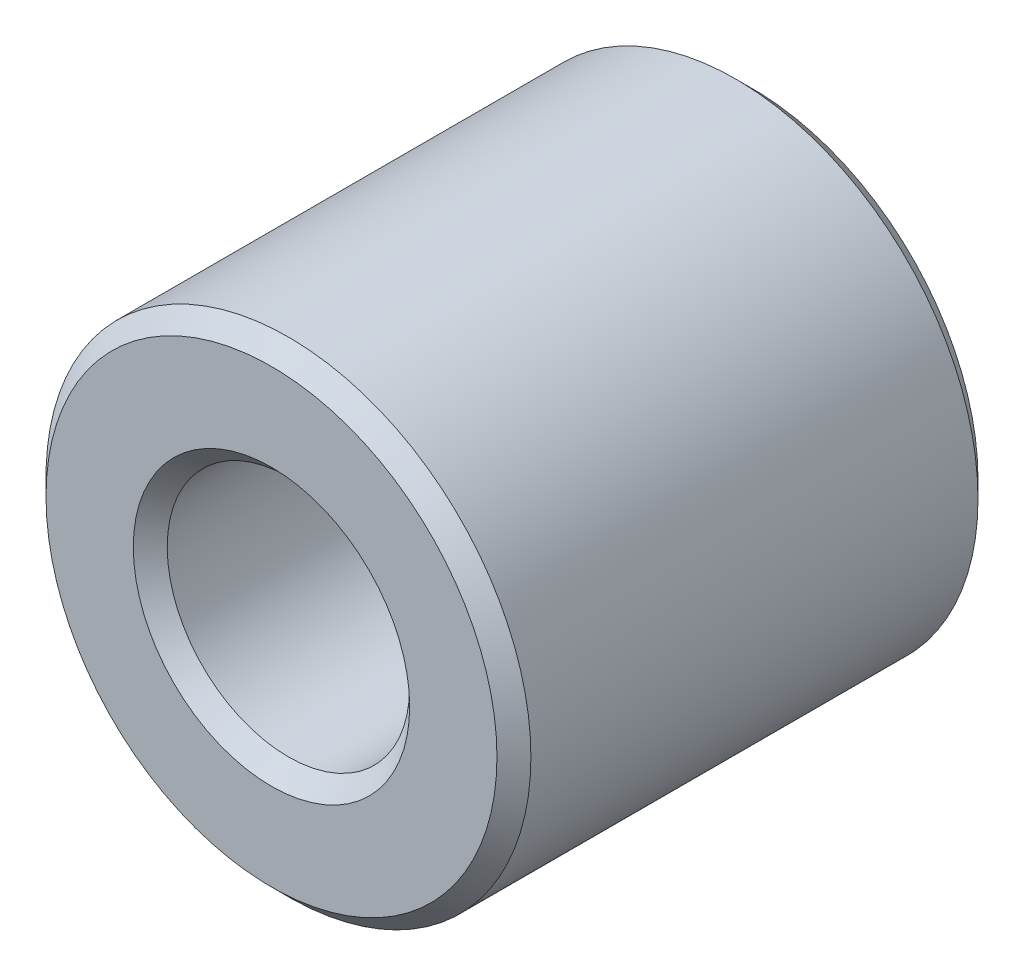
ISO-10303-21;
HEADER;
FILE_DESCRIPTION(('STEP AP214'),'2;1');
FILE_NAME('part.step','',(''),(''),'','','');
FILE_SCHEMA(('AUTOMOTIVE_DESIGN { 1 0 10303 214 1 1 1 1 }'));
ENDSEC;
DATA;
#1=APPLICATION_CONTEXT('core data for automotive mechanical design processes');
#2=APPLICATION_PROTOCOL_DEFINITION('international standard','automotive_design',2000,#1);
#3=PRODUCT_CONTEXT('',#1,'mechanical');
#4=PRODUCT('Part','Part','',(#3));
#5=PRODUCT_RELATED_PRODUCT_CATEGORY('part','',(#4));
#6=PRODUCT_DEFINITION_FORMATION('','',#4);
#7=PRODUCT_DEFINITION_CONTEXT('part definition',#1,'design');
#8=PRODUCT_DEFINITION('design','',#6,#7);
#9=PRODUCT_DEFINITION_SHAPE('','',#8);
#10=(LENGTH_UNIT() NAMED_UNIT(*) SI_UNIT(.MILLI.,.METRE.));
#11=(NAMED_UNIT(*) PLANE_ANGLE_UNIT() SI_UNIT($,.RADIAN.));
#12=(NAMED_UNIT(*) SI_UNIT($,.STERADIAN.) SOLID_ANGLE_UNIT());
#13=UNCERTAINTY_MEASURE_WITH_UNIT(LENGTH_MEASURE(1.E-05),#10,'distance_accuracy_value','');
#14=(GEOMETRIC_REPRESENTATION_CONTEXT(3) GLOBAL_UNCERTAINTY_ASSIGNED_CONTEXT((#13)) GLOBAL_UNIT_ASSIGNED_CONTEXT((#10,
#11,#12)) REPRESENTATION_CONTEXT('',''));
#15=CARTESIAN_POINT('',(0.,0.,0.));
#16=DIRECTION('',(0.,0.,1.));
#17=DIRECTION('',(1.,0.,0.));
#18=AXIS2_PLACEMENT_3D('',#15,#16,#17);
#19=CARTESIAN_POINT('',(0.,0.,-3.175));
#20=DIRECTION('',(0.,0.,1.));
#21=DIRECTION('',(1.,0.,0.));
#22=AXIS2_PLACEMENT_3D('',#19,#20,#21);
#23=CYLINDRICAL_SURFACE('',#22,3.2004);
#24=CARTESIAN_POINT('',(0.,0.,-2.950972));
#25=DIRECTION('',(0.,0.,1.));
#26=DIRECTION('',(1.,0.,0.));
#27=AXIS2_PLACEMENT_3D('',#24,#25,#26);
#28=CIRCLE('',#27,3.2004);
#29=CARTESIAN_POINT('',(3.2004,0.,-2.950972));
#30=VERTEX_POINT('',#29);
#31=EDGE_CURVE('E78',#30,#30,#28,.T.);
#32=ORIENTED_EDGE('',*,*,#31,.T.);
#33=EDGE_LOOP('',(#32));
#34=FACE_BOUND('',#33,.T.);
#35=CARTESIAN_POINT('',(0.,0.,2.950972));
#36=DIRECTION('',(0.,0.,1.));
#37=DIRECTION('',(1.,0.,0.));
#38=AXIS2_PLACEMENT_3D('',#35,#36,#37);
#39=CIRCLE('',#38,3.2004);
#40=CARTESIAN_POINT('',(3.2004,0.,2.950972));
#41=VERTEX_POINT('',#40);
#42=EDGE_CURVE('E82',#41,#41,#39,.F.);
#43=ORIENTED_EDGE('',*,*,#42,.T.);
#44=EDGE_LOOP('',(#43));
#45=FACE_BOUND('',#44,.T.);
#46=ADVANCED_FACE('F43',(#34,#45),#23,.T.);
#47=CARTESIAN_POINT('',(0.,0.,-3.175));
#48=DIRECTION('',(0.,0.,1.));
#49=DIRECTION('',(1.,0.,0.));
#50=AXIS2_PLACEMENT_3D('',#47,#48,#49);
#51=PLANE('',#50);
#52=CARTESIAN_POINT('',(0.,0.,-3.175));
#53=DIRECTION('',(0.,0.,1.));
#54=DIRECTION('',(1.,0.,0.));
#55=AXIS2_PLACEMENT_3D('',#52,#53,#54);
#56=CIRCLE('',#55,2.976372);
#57=CARTESIAN_POINT('',(2.976372,0.,-3.175));
#58=VERTEX_POINT('',#57);
#59=EDGE_CURVE('E70',#58,#58,#56,.F.);
#60=ORIENTED_EDGE('',*,*,#59,.T.);
#61=EDGE_LOOP('',(#60));
#62=FACE_BOUND('',#61,.T.);
#63=CARTESIAN_POINT('',(0.,0.,-3.175));
#64=DIRECTION('',(0.,0.,1.));
#65=DIRECTION('',(1.,0.,0.));
#66=AXIS2_PLACEMENT_3D('',#63,#64,#65);
#67=CIRCLE('',#66,1.824228);
#68=CARTESIAN_POINT('',(-1.824228,0.,-3.175));
#69=VERTEX_POINT('',#68);
#70=EDGE_CURVE('E74',#69,#69,#67,.T.);
#71=ORIENTED_EDGE('',*,*,#70,.T.);
#72=EDGE_LOOP('',(#71));
#73=FACE_BOUND('',#72,.T.);
#74=ADVANCED_FACE('F98',(#62,#73),#51,.F.);
#75=CARTESIAN_POINT('',(0.,0.,-3.175));
#76=DIRECTION('',(0.,0.,1.));
#77=DIRECTION('',(1.,0.,0.));
#78=AXIS2_PLACEMENT_3D('',#75,#76,#77);
#79=CYLINDRICAL_SURFACE('',#78,1.6002);
#80=CARTESIAN_POINT('',(0.,0.,-2.950972));
#81=DIRECTION('',(0.,0.,1.));
#82=DIRECTION('',(1.,0.,0.));
#83=AXIS2_PLACEMENT_3D('',#80,#81,#82);
#84=CIRCLE('',#83,1.6002);
#85=CARTESIAN_POINT('',(-1.6002,0.,-2.950972));
#86=VERTEX_POINT('',#85);
#87=EDGE_CURVE('E58',#86,#86,#84,.F.);
#88=ORIENTED_EDGE('',*,*,#87,.T.);
#89=EDGE_LOOP('',(#88));
#90=FACE_BOUND('',#89,.T.);
#91=CARTESIAN_POINT('',(0.,0.,2.950972));
#92=DIRECTION('',(0.,0.,1.));
#93=DIRECTION('',(1.,0.,0.));
#94=AXIS2_PLACEMENT_3D('',#91,#92,#93);
#95=CIRCLE('',#94,1.6002);
#96=CARTESIAN_POINT('',(1.6002,0.,2.950972));
#97=VERTEX_POINT('',#96);
#98=EDGE_CURVE('E64',#97,#97,#95,.T.);
#99=ORIENTED_EDGE('',*,*,#98,.T.);
#100=EDGE_LOOP('',(#99));
#101=FACE_BOUND('',#100,.T.);
#102=ADVANCED_FACE('F104',(#90,#101),#79,.F.);
#103=CARTESIAN_POINT('',(0.,0.,3.175));
#104=DIRECTION('',(0.,0.,1.));
#105=DIRECTION('',(1.,0.,0.));
#106=AXIS2_PLACEMENT_3D('',#103,#104,#105);
#107=PLANE('',#106);
#108=CARTESIAN_POINT('',(0.,0.,3.175));
#109=DIRECTION('',(0.,0.,1.));
#110=DIRECTION('',(1.,0.,0.));
#111=AXIS2_PLACEMENT_3D('',#108,#109,#110);
#112=CIRCLE('',#111,1.824228);
#113=CARTESIAN_POINT('',(1.824228,0.,3.175));
#114=VERTEX_POINT('',#113);
#115=EDGE_CURVE('E10',#114,#114,#112,.F.);
#116=ORIENTED_EDGE('',*,*,#115,.T.);
#117=EDGE_LOOP('',(#116));
#118=FACE_BOUND('',#117,.T.);
#119=CARTESIAN_POINT('',(0.,0.,3.175));
#120=DIRECTION('',(0.,0.,1.));
#121=DIRECTION('',(1.,0.,0.));
#122=AXIS2_PLACEMENT_3D('',#119,#120,#121);
#123=CIRCLE('',#122,2.976372);
#124=CARTESIAN_POINT('',(2.976372,0.,3.175));
#125=VERTEX_POINT('',#124);
#126=EDGE_CURVE('E52',#125,#125,#123,.T.);
#127=ORIENTED_EDGE('',*,*,#126,.T.);
#128=EDGE_LOOP('',(#127));
#129=FACE_BOUND('',#128,.T.);
#130=ADVANCED_FACE('F116',(#118,#129),#107,.T.);
#131=CARTESIAN_POINT('',(0.,0.,-2.950972));
#132=DIRECTION('',(0.,0.,1.));
#133=DIRECTION('',(1.,0.,0.));
#134=AXIS2_PLACEMENT_3D('',#131,#132,#133);
#135=CONICAL_SURFACE('',#134,3.2004,0.785398163397449);
#136=ORIENTED_EDGE('',*,*,#59,.F.);
#137=EDGE_LOOP('',(#136));
#138=FACE_BOUND('',#137,.T.);
#139=ORIENTED_EDGE('',*,*,#31,.F.);
#140=EDGE_LOOP('',(#139));
#141=FACE_BOUND('',#140,.T.);
#142=ADVANCED_FACE('F110',(#138,#141),#135,.T.);
#143=CARTESIAN_POINT('',(0.,0.,-3.175));
#144=DIRECTION('',(0.,0.,-1.));
#145=DIRECTION('',(-1.,0.,0.));
#146=AXIS2_PLACEMENT_3D('',#143,#144,#145);
#147=CONICAL_SURFACE('',#146,1.824228,0.785398163397447);
#148=CARTESIAN_POINT('',(-1.6002,0.,-2.950972));
#149=CARTESIAN_POINT('',(-1.602533625,0.,-2.953305625));
#150=CARTESIAN_POINT('',(-1.60486725,0.,-2.95563925));
#151=CARTESIAN_POINT('',(-1.6095345,0.,-2.9603065));
#152=CARTESIAN_POINT('',(-1.611868125,0.,-2.962640125));
#153=CARTESIAN_POINT('',(-1.616535375,0.,-2.967307375));
#154=CARTESIAN_POINT('',(-1.618869,0.,-2.969641));
#155=CARTESIAN_POINT('',(-1.62353625,0.,-2.97430825));
#156=CARTESIAN_POINT('',(-1.625869875,0.,-2.976641875));
#157=CARTESIAN_POINT('',(-1.630537125,0.,-2.981309125));
#158=CARTESIAN_POINT('',(-1.63287075,0.,-2.98364275));
#159=CARTESIAN_POINT('',(-1.637538,0.,-2.98831));
#160=CARTESIAN_POINT('',(-1.639871625,0.,-2.990643625));
#161=CARTESIAN_POINT('',(-1.644538875,0.,-2.995310875));
#162=CARTESIAN_POINT('',(-1.6468725,0.,-2.9976445));
#163=CARTESIAN_POINT('',(-1.65153975,0.,-3.00231175));
#164=CARTESIAN_POINT('',(-1.653873375,0.,-3.004645375));
#165=CARTESIAN_POINT('',(-1.658540625,0.,-3.009312625));
#166=CARTESIAN_POINT('',(-1.66087425,0.,-3.01164625));
#167=CARTESIAN_POINT('',(-1.6655415,0.,-3.0163135));
#168=CARTESIAN_POINT('',(-1.667875125,0.,-3.018647125));
#169=CARTESIAN_POINT('',(-1.672542375,0.,-3.023314375));
#170=CARTESIAN_POINT('',(-1.674876,0.,-3.025648));
#171=CARTESIAN_POINT('',(-1.67954325,0.,-3.03031525));
#172=CARTESIAN_POINT('',(-1.681876875,0.,-3.032648875));
#173=CARTESIAN_POINT('',(-1.686544125,0.,-3.037316125));
#174=CARTESIAN_POINT('',(-1.68887775,0.,-3.03964975));
#175=CARTESIAN_POINT('',(-1.693545,0.,-3.044317));
#176=CARTESIAN_POINT('',(-1.695878625,0.,-3.046650625));
#177=CARTESIAN_POINT('',(-1.700545875,0.,-3.051317875));
#178=CARTESIAN_POINT('',(-1.7028795,0.,-3.0536515));
#179=CARTESIAN_POINT('',(-1.70754675,0.,-3.05831875));
#180=CARTESIAN_POINT('',(-1.709880375,0.,-3.060652375));
#181=CARTESIAN_POINT('',(-1.714547625,0.,-3.065319625));
#182=CARTESIAN_POINT('',(-1.71688125,0.,-3.06765325));
#183=CARTESIAN_POINT('',(-1.7215485,0.,-3.0723205));
#184=CARTESIAN_POINT('',(-1.723882125,0.,-3.074654125));
#185=CARTESIAN_POINT('',(-1.728549375,0.,-3.079321375));
#186=CARTESIAN_POINT('',(-1.730883,0.,-3.081655));
#187=CARTESIAN_POINT('',(-1.73555025,0.,-3.08632225));
#188=CARTESIAN_POINT('',(-1.737883875,0.,-3.088655875));
#189=CARTESIAN_POINT('',(-1.742551125,0.,-3.093323125));
#190=CARTESIAN_POINT('',(-1.74488475,0.,-3.09565675));
#191=CARTESIAN_POINT('',(-1.749552,0.,-3.100324));
#192=CARTESIAN_POINT('',(-1.751885625,0.,-3.102657625));
#193=CARTESIAN_POINT('',(-1.756552875,0.,-3.107324875));
#194=CARTESIAN_POINT('',(-1.7588865,0.,-3.1096585));
#195=CARTESIAN_POINT('',(-1.76355375,0.,-3.11432575));
#196=CARTESIAN_POINT('',(-1.765887375,0.,-3.116659375));
#197=CARTESIAN_POINT('',(-1.770554625,0.,-3.121326625));
#198=CARTESIAN_POINT('',(-1.77288825,0.,-3.12366025));
#199=CARTESIAN_POINT('',(-1.7775555,0.,-3.1283275));
#200=CARTESIAN_POINT('',(-1.779889125,0.,-3.130661125));
#201=CARTESIAN_POINT('',(-1.784556375,0.,-3.135328375));
#202=CARTESIAN_POINT('',(-1.78689,0.,-3.137662));
#203=CARTESIAN_POINT('',(-1.79155725,0.,-3.14232925));
#204=CARTESIAN_POINT('',(-1.793890875,0.,-3.144662875));
#205=CARTESIAN_POINT('',(-1.798558125,0.,-3.149330125));
#206=CARTESIAN_POINT('',(-1.80089175,0.,-3.15166375));
#207=CARTESIAN_POINT('',(-1.805559,0.,-3.156331));
#208=CARTESIAN_POINT('',(-1.807892625,0.,-3.158664625));
#209=CARTESIAN_POINT('',(-1.812559875,0.,-3.163331875));
#210=CARTESIAN_POINT('',(-1.8148935,0.,-3.1656655));
#211=CARTESIAN_POINT('',(-1.81956075,0.,-3.17033275));
#212=CARTESIAN_POINT('',(-1.821894375,0.,-3.172666375));
#213=CARTESIAN_POINT('',(-1.824228,0.,-3.175));
#214=B_SPLINE_CURVE_WITH_KNOTS('',3,(#148,#149,#150,#151,#152,#153,#154,#155,#156,#157,#158,
#159,#160,#161,#162,#163,#164,#165,#166,#167,#168,#169,#170,#171,#172,#173,#174,#175,#176,#177,
#178,#179,#180,#181,#182,#183,#184,#185,#186,#187,#188,#189,#190,#191,#192,#193,#194,#195,#196,
#197,#198,#199,#200,#201,#202,#203,#204,#205,#206,#207,#208,#209,#210,#211,#212,#213),
.UNSPECIFIED.,.F.,.F.,(4,2,2,2,2,2,2,2,2,2,2,2,2,2,2,2,2,2,2,2,2,2,2,2,2,2,2,2,2,2,2,2,4),(0.,
0.00990073237347879,0.0198014647469577,0.0297021971204365,0.0396029294939153,0.0495036618673941,
0.0594043942408734,0.0693051266143522,0.0792058589878309,0.0891065913613097,0.0990073237347887,
0.108908056108268,0.118808788481747,0.128709520855226,0.138610253228704,0.148510985602183,
0.158411717975662,0.168312450349141,0.17821318272262,0.188113915096099,0.198014647469578,
0.207915379843056,0.217816112216536,0.227716844590014,0.237617576963493,0.247518309336972,
0.257419041710451,0.26731977408393,0.277220506457409,0.287121238830888,0.297021971204366,
0.306922703577845,0.316823435951324),.UNSPECIFIED.);
#215=EDGE_CURVE('BSEAM95',#86,#69,#214,.T.);
#216=ORIENTED_EDGE('',*,*,#87,.F.);
#217=ORIENTED_EDGE('',*,*,#70,.F.);
#218=ORIENTED_EDGE('',*,*,#215,.T.);
#219=ORIENTED_EDGE('',*,*,#215,.F.);
#220=EDGE_LOOP('',(#216,#218,#217,#219));
#221=FACE_BOUND('',#220,.T.);
#222=ADVANCED_FACE('F95',(#221),#147,.F.);
#223=CARTESIAN_POINT('',(0.,0.,2.950972));
#224=DIRECTION('',(0.,0.,1.));
#225=DIRECTION('',(1.,0.,0.));
#226=AXIS2_PLACEMENT_3D('',#223,#224,#225);
#227=CONICAL_SURFACE('',#226,1.6002,0.785398163397453);
#228=ORIENTED_EDGE('',*,*,#115,.F.);
#229=EDGE_LOOP('',(#228));
#230=FACE_BOUND('',#229,.T.);
#231=ORIENTED_EDGE('',*,*,#98,.F.);
#232=EDGE_LOOP('',(#231));
#233=FACE_BOUND('',#232,.T.);
#234=ADVANCED_FACE('F91',(#230,#233),#227,.F.);
#235=CARTESIAN_POINT('',(0.,0.,3.175));
#236=DIRECTION('',(0.,0.,-1.));
#237=DIRECTION('',(-1.,0.,0.));
#238=AXIS2_PLACEMENT_3D('',#235,#236,#237);
#239=CONICAL_SURFACE('',#238,2.976372,0.785398163397449);
#240=ORIENTED_EDGE('',*,*,#42,.F.);
#241=EDGE_LOOP('',(#240));
#242=FACE_BOUND('',#241,.T.);
#243=ORIENTED_EDGE('',*,*,#126,.F.);
#244=EDGE_LOOP('',(#243));
#245=FACE_BOUND('',#244,.T.);
#246=ADVANCED_FACE('F46',(#242,#245),#239,.T.);
#247=CLOSED_SHELL('',(#46,#74,#102,#130,#142,#222,#234,#246));
#248=MANIFOLD_SOLID_BREP('B2',#247);
#249=ADVANCED_BREP_SHAPE_REPRESENTATION('',(#18,#248),#14);
#250=SHAPE_DEFINITION_REPRESENTATION(#9,#249);
ENDSEC;
END-ISO-10303-21;
